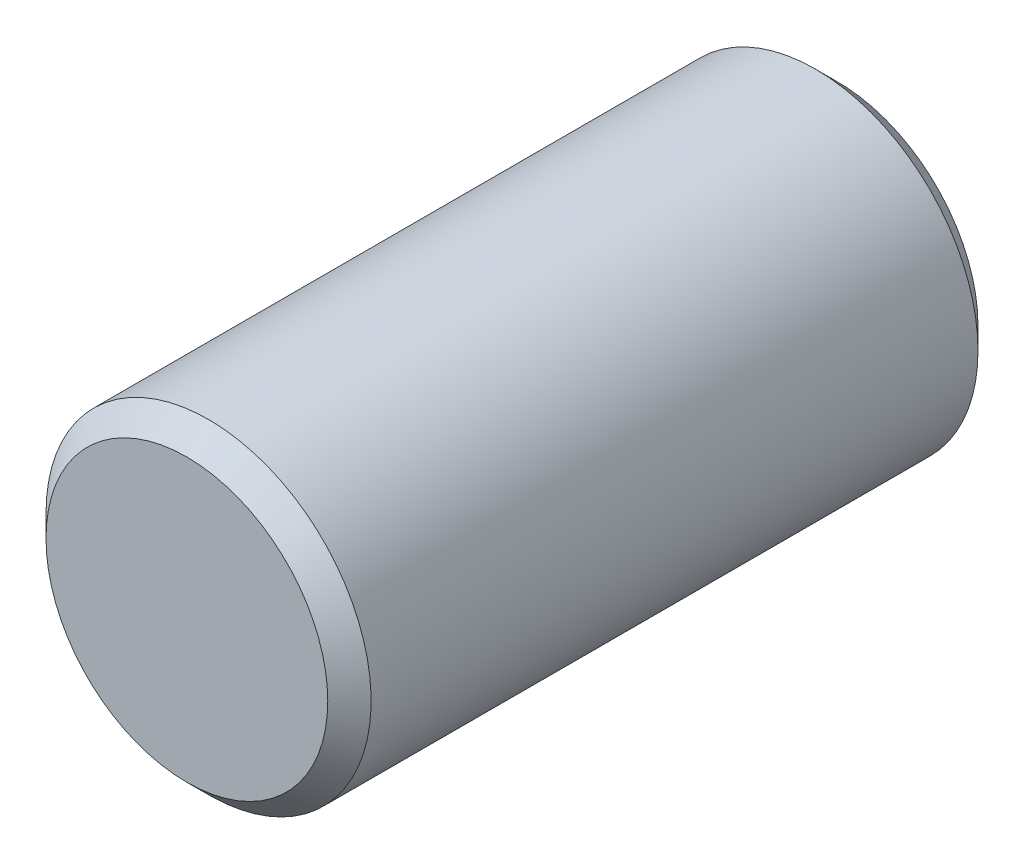
ISO-10303-21;
HEADER;
FILE_DESCRIPTION(('STEP AP214'),'2;1');
FILE_NAME('part.step','',(''),(''),'','','');
FILE_SCHEMA(('AUTOMOTIVE_DESIGN { 1 0 10303 214 1 1 1 1 }'));
ENDSEC;
DATA;
#1=APPLICATION_CONTEXT('core data for automotive mechanical design processes');
#2=APPLICATION_PROTOCOL_DEFINITION('international standard','automotive_design',2000,#1);
#3=PRODUCT_CONTEXT('',#1,'mechanical');
#4=PRODUCT('Part','Part','',(#3));
#5=PRODUCT_RELATED_PRODUCT_CATEGORY('part','',(#4));
#6=PRODUCT_DEFINITION_FORMATION('','',#4);
#7=PRODUCT_DEFINITION_CONTEXT('part definition',#1,'design');
#8=PRODUCT_DEFINITION('design','',#6,#7);
#9=PRODUCT_DEFINITION_SHAPE('','',#8);
#10=(LENGTH_UNIT() NAMED_UNIT(*) SI_UNIT(.MILLI.,.METRE.));
#11=(NAMED_UNIT(*) PLANE_ANGLE_UNIT() SI_UNIT($,.RADIAN.));
#12=(NAMED_UNIT(*) SI_UNIT($,.STERADIAN.) SOLID_ANGLE_UNIT());
#13=UNCERTAINTY_MEASURE_WITH_UNIT(LENGTH_MEASURE(1.E-05),#10,'distance_accuracy_value','');
#14=(GEOMETRIC_REPRESENTATION_CONTEXT(3) GLOBAL_UNCERTAINTY_ASSIGNED_CONTEXT((#13)) GLOBAL_UNIT_ASSIGNED_CONTEXT((#10,
#11,#12)) REPRESENTATION_CONTEXT('',''));
#15=CARTESIAN_POINT('',(0.,0.,0.));
#16=DIRECTION('',(0.,0.,1.));
#17=DIRECTION('',(1.,0.,0.));
#18=AXIS2_PLACEMENT_3D('',#15,#16,#17);
#19=CARTESIAN_POINT('',(0.,0.,38.1));
#20=DIRECTION('',(0.,0.,-1.));
#21=DIRECTION('',(-1.,0.,0.));
#22=AXIS2_PLACEMENT_3D('',#19,#20,#21);
#23=CYLINDRICAL_SURFACE('',#22,9.525);
#24=CARTESIAN_POINT('',(0.,0.,1.27000000000004));
#25=DIRECTION('',(0.,0.,1.));
#26=DIRECTION('',(1.,0.,0.));
#27=AXIS2_PLACEMENT_3D('',#24,#25,#26);
#28=CIRCLE('',#27,9.525);
#29=CARTESIAN_POINT('',(-9.525,0.,1.27000000000004));
#30=VERTEX_POINT('',#29);
#31=EDGE_CURVE('E49',#30,#30,#28,.T.);
#32=CARTESIAN_POINT('',(0.,0.,36.83));
#33=DIRECTION('',(0.,0.,1.));
#34=DIRECTION('',(1.,0.,0.));
#35=AXIS2_PLACEMENT_3D('',#32,#33,#34);
#36=CIRCLE('',#35,9.525);
#37=CARTESIAN_POINT('',(-9.525,0.,36.83));
#38=VERTEX_POINT('',#37);
#39=EDGE_CURVE('E53',#38,#38,#36,.F.);
#40=CARTESIAN_POINT('',(-9.525,0.,1.27000000000004));
#41=CARTESIAN_POINT('',(-9.525,0.,1.6404166666667));
#42=CARTESIAN_POINT('',(-9.525,0.,2.01083333333337));
#43=CARTESIAN_POINT('',(-9.525,0.,2.7516666666667));
#44=CARTESIAN_POINT('',(-9.525,0.,3.12208333333337));
#45=CARTESIAN_POINT('',(-9.525,0.,3.8629166666667));
#46=CARTESIAN_POINT('',(-9.525,0.,4.23333333333337));
#47=CARTESIAN_POINT('',(-9.525,0.,4.9741666666667));
#48=CARTESIAN_POINT('',(-9.525,0.,5.34458333333337));
#49=CARTESIAN_POINT('',(-9.525,0.,6.0854166666667));
#50=CARTESIAN_POINT('',(-9.525,0.,6.45583333333337));
#51=CARTESIAN_POINT('',(-9.525,0.,7.1966666666667));
#52=CARTESIAN_POINT('',(-9.525,0.,7.56708333333337));
#53=CARTESIAN_POINT('',(-9.525,0.,8.3079166666667));
#54=CARTESIAN_POINT('',(-9.525,0.,8.67833333333337));
#55=CARTESIAN_POINT('',(-9.525,0.,9.4191666666667));
#56=CARTESIAN_POINT('',(-9.525,0.,9.78958333333336));
#57=CARTESIAN_POINT('',(-9.525,0.,10.5304166666667));
#58=CARTESIAN_POINT('',(-9.525,0.,10.9008333333334));
#59=CARTESIAN_POINT('',(-9.525,0.,11.6416666666667));
#60=CARTESIAN_POINT('',(-9.525,0.,12.0120833333334));
#61=CARTESIAN_POINT('',(-9.525,0.,12.7529166666667));
#62=CARTESIAN_POINT('',(-9.525,0.,13.1233333333334));
#63=CARTESIAN_POINT('',(-9.525,0.,13.8641666666667));
#64=CARTESIAN_POINT('',(-9.525,0.,14.2345833333334));
#65=CARTESIAN_POINT('',(-9.525,0.,14.9754166666667));
#66=CARTESIAN_POINT('',(-9.525,0.,15.3458333333334));
#67=CARTESIAN_POINT('',(-9.525,0.,16.0866666666667));
#68=CARTESIAN_POINT('',(-9.525,0.,16.4570833333334));
#69=CARTESIAN_POINT('',(-9.525,0.,17.1979166666667));
#70=CARTESIAN_POINT('',(-9.525,0.,17.5683333333334));
#71=CARTESIAN_POINT('',(-9.525,0.,18.3091666666667));
#72=CARTESIAN_POINT('',(-9.525,0.,18.6795833333334));
#73=CARTESIAN_POINT('',(-9.525,0.,19.4204166666667));
#74=CARTESIAN_POINT('',(-9.525,0.,19.7908333333334));
#75=CARTESIAN_POINT('',(-9.525,0.,20.5316666666667));
#76=CARTESIAN_POINT('',(-9.525,0.,20.9020833333334));
#77=CARTESIAN_POINT('',(-9.525,0.,21.6429166666667));
#78=CARTESIAN_POINT('',(-9.525,0.,22.0133333333334));
#79=CARTESIAN_POINT('',(-9.525,0.,22.7541666666667));
#80=CARTESIAN_POINT('',(-9.525,0.,23.1245833333334));
#81=CARTESIAN_POINT('',(-9.525,0.,23.8654166666667));
#82=CARTESIAN_POINT('',(-9.525,0.,24.2358333333334));
#83=CARTESIAN_POINT('',(-9.525,0.,24.9766666666667));
#84=CARTESIAN_POINT('',(-9.525,0.,25.3470833333334));
#85=CARTESIAN_POINT('',(-9.525,0.,26.0879166666667));
#86=CARTESIAN_POINT('',(-9.525,0.,26.4583333333334));
#87=CARTESIAN_POINT('',(-9.525,0.,27.1991666666667));
#88=CARTESIAN_POINT('',(-9.525,0.,27.5695833333334));
#89=CARTESIAN_POINT('',(-9.525,0.,28.3104166666667));
#90=CARTESIAN_POINT('',(-9.525,0.,28.6808333333334));
#91=CARTESIAN_POINT('',(-9.525,0.,29.4216666666667));
#92=CARTESIAN_POINT('',(-9.525,0.,29.7920833333334));
#93=CARTESIAN_POINT('',(-9.525,0.,30.5329166666667));
#94=CARTESIAN_POINT('',(-9.525,0.,30.9033333333334));
#95=CARTESIAN_POINT('',(-9.525,0.,31.6441666666667));
#96=CARTESIAN_POINT('',(-9.525,0.,32.0145833333334));
#97=CARTESIAN_POINT('',(-9.525,0.,32.7554166666667));
#98=CARTESIAN_POINT('',(-9.525,0.,33.1258333333334));
#99=CARTESIAN_POINT('',(-9.525,0.,33.8666666666667));
#100=CARTESIAN_POINT('',(-9.525,0.,34.2370833333334));
#101=CARTESIAN_POINT('',(-9.525,0.,34.9779166666667));
#102=CARTESIAN_POINT('',(-9.525,0.,35.3483333333334));
#103=CARTESIAN_POINT('',(-9.525,0.,36.0891666666667));
#104=CARTESIAN_POINT('',(-9.525,0.,36.4595833333334));
#105=CARTESIAN_POINT('',(-9.525,0.,36.83));
#106=B_SPLINE_CURVE_WITH_KNOTS('',3,(#40,#41,#42,#43,#44,#45,#46,#47,#48,#49,#50,#51,#52,#53,
#54,#55,#56,#57,#58,#59,#60,#61,#62,#63,#64,#65,#66,#67,#68,#69,#70,#71,#72,#73,#74,#75,#76,#77,
#78,#79,#80,#81,#82,#83,#84,#85,#86,#87,#88,#89,#90,#91,#92,#93,#94,#95,#96,#97,#98,#99,#100,
#101,#102,#103,#104,#105),.UNSPECIFIED.,.F.,.F.,(4,2,2,2,2,2,2,2,2,2,2,2,2,2,2,2,2,2,2,2,2,2,2,
2,2,2,2,2,2,2,2,2,4),(0.,1.11125,2.2225,3.33375,4.445,5.55625,6.6675,7.77875,8.89,10.00125,
11.1125,12.22375,13.335,14.44625,15.5575,16.66875,17.78,18.89125,20.0025,21.11375,22.225,
23.33625,24.4475,25.55875,26.67,27.78125,28.8925,30.00375,31.115,32.22625,33.3375,34.44875,
35.56),.UNSPECIFIED.);
#107=EDGE_CURVE('BSEAM37',#30,#38,#106,.T.);
#108=ORIENTED_EDGE('',*,*,#31,.T.);
#109=ORIENTED_EDGE('',*,*,#39,.T.);
#110=ORIENTED_EDGE('',*,*,#107,.T.);
#111=ORIENTED_EDGE('',*,*,#107,.F.);
#112=EDGE_LOOP('',(#108,#110,#109,#111));
#113=FACE_BOUND('',#112,.T.);
#114=ADVANCED_FACE('F37',(#113),#23,.T.);
#115=CARTESIAN_POINT('',(0.,0.,38.1));
#116=DIRECTION('',(0.,0.,1.));
#117=DIRECTION('',(1.,0.,0.));
#118=AXIS2_PLACEMENT_3D('',#115,#116,#117);
#119=PLANE('',#118);
#120=CARTESIAN_POINT('',(0.,0.,38.1));
#121=DIRECTION('',(0.,0.,1.));
#122=DIRECTION('',(1.,0.,0.));
#123=AXIS2_PLACEMENT_3D('',#120,#121,#122);
#124=CIRCLE('',#123,8.25500000000002);
#125=CARTESIAN_POINT('',(8.25500000000002,0.,38.1));
#126=VERTEX_POINT('',#125);
#127=EDGE_CURVE('E10',#126,#126,#124,.T.);
#128=ORIENTED_EDGE('',*,*,#127,.T.);
#129=EDGE_LOOP('',(#128));
#130=FACE_BOUND('',#129,.T.);
#131=ADVANCED_FACE('F69',(#130),#119,.T.);
#132=CARTESIAN_POINT('',(0.,0.,0.));
#133=DIRECTION('',(0.,0.,1.));
#134=DIRECTION('',(1.,0.,0.));
#135=AXIS2_PLACEMENT_3D('',#132,#133,#134);
#136=PLANE('',#135);
#137=CARTESIAN_POINT('',(0.,0.,0.));
#138=DIRECTION('',(0.,0.,1.));
#139=DIRECTION('',(1.,0.,0.));
#140=AXIS2_PLACEMENT_3D('',#137,#138,#139);
#141=CIRCLE('',#140,8.25499999999995);
#142=CARTESIAN_POINT('',(8.25499999999995,0.,0.));
#143=VERTEX_POINT('',#142);
#144=EDGE_CURVE('E45',#143,#143,#141,.F.);
#145=ORIENTED_EDGE('',*,*,#144,.T.);
#146=EDGE_LOOP('',(#145));
#147=FACE_BOUND('',#146,.T.);
#148=ADVANCED_FACE('F66',(#147),#136,.F.);
#149=CARTESIAN_POINT('',(0.,0.,1.27000000000004));
#150=DIRECTION('',(0.,0.,1.));
#151=DIRECTION('',(1.,0.,0.));
#152=AXIS2_PLACEMENT_3D('',#149,#150,#151);
#153=CONICAL_SURFACE('',#152,9.525,0.785398163397452);
#154=ORIENTED_EDGE('',*,*,#144,.F.);
#155=EDGE_LOOP('',(#154));
#156=FACE_BOUND('',#155,.T.);
#157=ORIENTED_EDGE('',*,*,#31,.F.);
#158=EDGE_LOOP('',(#157));
#159=FACE_BOUND('',#158,.T.);
#160=ADVANCED_FACE('F62',(#156,#159),#153,.T.);
#161=CARTESIAN_POINT('',(0.,0.,38.1));
#162=DIRECTION('',(0.,0.,-1.));
#163=DIRECTION('',(-1.,0.,0.));
#164=AXIS2_PLACEMENT_3D('',#161,#162,#163);
#165=CONICAL_SURFACE('',#164,8.25500000000002,0.785398163397447);
#166=ORIENTED_EDGE('',*,*,#39,.F.);
#167=EDGE_LOOP('',(#166));
#168=FACE_BOUND('',#167,.T.);
#169=ORIENTED_EDGE('',*,*,#127,.F.);
#170=EDGE_LOOP('',(#169));
#171=FACE_BOUND('',#170,.T.);
#172=ADVANCED_FACE('F40',(#168,#171),#165,.T.);
#173=CLOSED_SHELL('',(#114,#131,#148,#160,#172));
#174=MANIFOLD_SOLID_BREP('B2',#173);
#175=ADVANCED_BREP_SHAPE_REPRESENTATION('',(#18,#174),#14);
#176=SHAPE_DEFINITION_REPRESENTATION(#9,#175);
ENDSEC;
END-ISO-10303-21;
